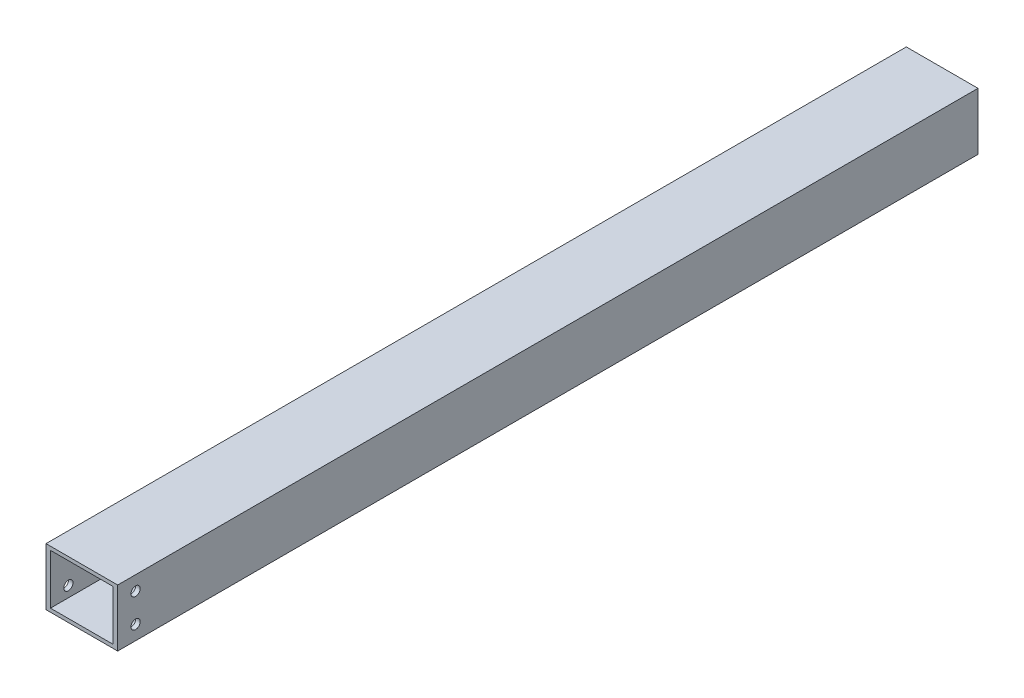
ISO-10303-21;
HEADER;
FILE_DESCRIPTION(('STEP AP214'),'2;1');
FILE_NAME('part.step','',(''),(''),'','','');
FILE_SCHEMA(('AUTOMOTIVE_DESIGN { 1 0 10303 214 1 1 1 1 }'));
ENDSEC;
DATA;
#1=APPLICATION_CONTEXT('core data for automotive mechanical design processes');
#2=APPLICATION_PROTOCOL_DEFINITION('international standard','automotive_design',2000,#1);
#3=PRODUCT_CONTEXT('',#1,'mechanical');
#4=PRODUCT('Part','Part','',(#3));
#5=PRODUCT_RELATED_PRODUCT_CATEGORY('part','',(#4));
#6=PRODUCT_DEFINITION_FORMATION('','',#4);
#7=PRODUCT_DEFINITION_CONTEXT('part definition',#1,'design');
#8=PRODUCT_DEFINITION('design','',#6,#7);
#9=PRODUCT_DEFINITION_SHAPE('','',#8);
#10=(LENGTH_UNIT() NAMED_UNIT(*) SI_UNIT(.MILLI.,.METRE.));
#11=(NAMED_UNIT(*) PLANE_ANGLE_UNIT() SI_UNIT($,.RADIAN.));
#12=(NAMED_UNIT(*) SI_UNIT($,.STERADIAN.) SOLID_ANGLE_UNIT());
#13=UNCERTAINTY_MEASURE_WITH_UNIT(LENGTH_MEASURE(1.E-05),#10,'distance_accuracy_value','');
#14=(GEOMETRIC_REPRESENTATION_CONTEXT(3) GLOBAL_UNCERTAINTY_ASSIGNED_CONTEXT((#13)) GLOBAL_UNIT_ASSIGNED_CONTEXT((#10,
#11,#12)) REPRESENTATION_CONTEXT('',''));
#15=CARTESIAN_POINT('',(0.,0.,0.));
#16=DIRECTION('',(0.,0.,1.));
#17=DIRECTION('',(1.,0.,0.));
#18=AXIS2_PLACEMENT_3D('',#15,#16,#17);
#19=CARTESIAN_POINT('',(0.,0.,304.8));
#20=DIRECTION('',(0.,0.,-1.));
#21=DIRECTION('',(-1.,0.,0.));
#22=AXIS2_PLACEMENT_3D('',#19,#20,#21);
#23=PLANE('',#22);
#24=DIRECTION('',(0.,1.,0.));
#25=VECTOR('',#24,1.);
#26=CARTESIAN_POINT('',(12.7,-10.137835371181,304.8));
#27=LINE('',#26,#25);
#28=CARTESIAN_POINT('',(12.7,-10.137835371181,304.8));
#29=VERTEX_POINT('',#28);
#30=CARTESIAN_POINT('',(12.7,10.137835371181,304.8));
#31=VERTEX_POINT('',#30);
#32=EDGE_CURVE('E138',#29,#31,#27,.T.);
#33=ORIENTED_EDGE('',*,*,#32,.T.);
#34=DIRECTION('',(-1.,0.,0.));
#35=VECTOR('',#34,1.);
#36=CARTESIAN_POINT('',(-12.7,10.137835371181,304.8));
#37=LINE('',#36,#35);
#38=CARTESIAN_POINT('',(-12.7,10.137835371181,304.8));
#39=VERTEX_POINT('',#38);
#40=EDGE_CURVE('E141',#31,#39,#37,.T.);
#41=ORIENTED_EDGE('',*,*,#40,.T.);
#42=DIRECTION('',(0.,-1.,0.));
#43=VECTOR('',#42,1.);
#44=CARTESIAN_POINT('',(-12.7,-10.137835371181,304.8));
#45=LINE('',#44,#43);
#46=CARTESIAN_POINT('',(-12.7,-10.137835371181,304.8));
#47=VERTEX_POINT('',#46);
#48=EDGE_CURVE('E144',#39,#47,#45,.T.);
#49=ORIENTED_EDGE('',*,*,#48,.T.);
#50=DIRECTION('',(1.,0.,0.));
#51=VECTOR('',#50,1.);
#52=CARTESIAN_POINT('',(-12.7,-10.137835371181,304.8));
#53=LINE('',#52,#51);
#54=EDGE_CURVE('E146',#47,#29,#53,.T.);
#55=ORIENTED_EDGE('',*,*,#54,.T.);
#56=EDGE_LOOP('',(#33,#41,#49,#55));
#57=FACE_BOUND('',#56,.T.);
#58=DIRECTION('',(0.,1.,0.));
#59=VECTOR('',#58,1.);
#60=CARTESIAN_POINT('',(11.1125,-8.87060594978338,304.8));
#61=LINE('',#60,#59);
#62=CARTESIAN_POINT('',(11.1125,-8.87060594978338,304.8));
#63=VERTEX_POINT('',#62);
#64=CARTESIAN_POINT('',(11.1125,8.87060594978337,304.8));
#65=VERTEX_POINT('',#64);
#66=EDGE_CURVE('E100',#63,#65,#61,.T.);
#67=ORIENTED_EDGE('',*,*,#66,.F.);
#68=DIRECTION('',(1.,0.,0.));
#69=VECTOR('',#68,1.);
#70=CARTESIAN_POINT('',(-11.1125,-8.87060594978338,304.8));
#71=LINE('',#70,#69);
#72=CARTESIAN_POINT('',(-11.1125,-8.87060594978338,304.8));
#73=VERTEX_POINT('',#72);
#74=EDGE_CURVE('E122',#73,#63,#71,.T.);
#75=ORIENTED_EDGE('',*,*,#74,.F.);
#76=DIRECTION('',(0.,-1.,0.));
#77=VECTOR('',#76,1.);
#78=CARTESIAN_POINT('',(-11.1125,-8.87060594978338,304.8));
#79=LINE('',#78,#77);
#80=CARTESIAN_POINT('',(-11.1125,8.87060594978337,304.8));
#81=VERTEX_POINT('',#80);
#82=EDGE_CURVE('E120',#81,#73,#79,.T.);
#83=ORIENTED_EDGE('',*,*,#82,.F.);
#84=DIRECTION('',(-1.,0.,0.));
#85=VECTOR('',#84,1.);
#86=CARTESIAN_POINT('',(-11.1125,8.87060594978337,304.8));
#87=LINE('',#86,#85);
#88=EDGE_CURVE('E108',#65,#81,#87,.T.);
#89=ORIENTED_EDGE('',*,*,#88,.F.);
#90=EDGE_LOOP('',(#67,#75,#83,#89));
#91=FACE_BOUND('',#90,.T.);
#92=ADVANCED_FACE('F33',(#57,#91),#23,.F.);
#93=CARTESIAN_POINT('',(0.,0.,0.));
#94=DIRECTION('',(0.,0.,-1.));
#95=DIRECTION('',(-1.,0.,0.));
#96=AXIS2_PLACEMENT_3D('',#93,#94,#95);
#97=PLANE('',#96);
#98=DIRECTION('',(0.,1.,0.));
#99=VECTOR('',#98,1.);
#100=CARTESIAN_POINT('',(12.7,-10.137835371181,0.));
#101=LINE('',#100,#99);
#102=CARTESIAN_POINT('',(12.7,-10.137835371181,0.));
#103=VERTEX_POINT('',#102);
#104=CARTESIAN_POINT('',(12.7,10.137835371181,0.));
#105=VERTEX_POINT('',#104);
#106=EDGE_CURVE('E116',#103,#105,#101,.T.);
#107=ORIENTED_EDGE('',*,*,#106,.F.);
#108=DIRECTION('',(1.,0.,0.));
#109=VECTOR('',#108,1.);
#110=CARTESIAN_POINT('',(-12.7,-10.137835371181,0.));
#111=LINE('',#110,#109);
#112=CARTESIAN_POINT('',(-12.7,-10.137835371181,0.));
#113=VERTEX_POINT('',#112);
#114=EDGE_CURVE('E142',#113,#103,#111,.T.);
#115=ORIENTED_EDGE('',*,*,#114,.F.);
#116=DIRECTION('',(0.,-1.,0.));
#117=VECTOR('',#116,1.);
#118=CARTESIAN_POINT('',(-12.7,-10.137835371181,0.));
#119=LINE('',#118,#117);
#120=CARTESIAN_POINT('',(-12.7,10.137835371181,0.));
#121=VERTEX_POINT('',#120);
#122=EDGE_CURVE('E153',#121,#113,#119,.T.);
#123=ORIENTED_EDGE('',*,*,#122,.F.);
#124=DIRECTION('',(-1.,0.,0.));
#125=VECTOR('',#124,1.);
#126=CARTESIAN_POINT('',(-12.7,10.137835371181,0.));
#127=LINE('',#126,#125);
#128=EDGE_CURVE('E151',#105,#121,#127,.T.);
#129=ORIENTED_EDGE('',*,*,#128,.F.);
#130=EDGE_LOOP('',(#107,#115,#123,#129));
#131=FACE_BOUND('',#130,.T.);
#132=DIRECTION('',(1.,0.,0.));
#133=VECTOR('',#132,1.);
#134=CARTESIAN_POINT('',(-11.1125,-8.87060594978338,0.));
#135=LINE('',#134,#133);
#136=CARTESIAN_POINT('',(-11.1125,-8.87060594978338,0.));
#137=VERTEX_POINT('',#136);
#138=CARTESIAN_POINT('',(11.1125,-8.87060594978338,0.));
#139=VERTEX_POINT('',#138);
#140=EDGE_CURVE('E109',#137,#139,#135,.T.);
#141=ORIENTED_EDGE('',*,*,#140,.T.);
#142=DIRECTION('',(0.,1.,0.));
#143=VECTOR('',#142,1.);
#144=CARTESIAN_POINT('',(11.1125,-8.87060594978338,0.));
#145=LINE('',#144,#143);
#146=CARTESIAN_POINT('',(11.1125,8.87060594978337,0.));
#147=VERTEX_POINT('',#146);
#148=EDGE_CURVE('E58',#139,#147,#145,.T.);
#149=ORIENTED_EDGE('',*,*,#148,.T.);
#150=DIRECTION('',(-1.,0.,0.));
#151=VECTOR('',#150,1.);
#152=CARTESIAN_POINT('',(-11.1125,8.87060594978337,0.));
#153=LINE('',#152,#151);
#154=CARTESIAN_POINT('',(-11.1125,8.87060594978337,0.));
#155=VERTEX_POINT('',#154);
#156=EDGE_CURVE('E115',#147,#155,#153,.T.);
#157=ORIENTED_EDGE('',*,*,#156,.T.);
#158=DIRECTION('',(0.,-1.,0.));
#159=VECTOR('',#158,1.);
#160=CARTESIAN_POINT('',(-11.1125,-8.87060594978338,0.));
#161=LINE('',#160,#159);
#162=EDGE_CURVE('E130',#155,#137,#161,.T.);
#163=ORIENTED_EDGE('',*,*,#162,.T.);
#164=EDGE_LOOP('',(#141,#149,#157,#163));
#165=FACE_BOUND('',#164,.T.);
#166=ADVANCED_FACE('F200',(#131,#165),#97,.T.);
#167=CARTESIAN_POINT('',(12.7,-10.137835371181,304.8));
#168=DIRECTION('',(-1.,0.,0.));
#169=DIRECTION('',(0.,0.,1.));
#170=AXIS2_PLACEMENT_3D('',#167,#168,#169);
#171=PLANE('',#170);
#172=CARTESIAN_POINT('',(12.7,-5.08,298.45));
#173=DIRECTION('',(1.,0.,0.));
#174=DIRECTION('',(0.,0.,1.));
#175=AXIS2_PLACEMENT_3D('',#172,#173,#174);
#176=CIRCLE('',#175,1.63195);
#177=CARTESIAN_POINT('',(12.7,-5.08,300.08195));
#178=VERTEX_POINT('',#177);
#179=EDGE_CURVE('E179',#178,#178,#176,.T.);
#180=ORIENTED_EDGE('',*,*,#179,.F.);
#181=EDGE_LOOP('',(#180));
#182=FACE_BOUND('',#181,.T.);
#183=CARTESIAN_POINT('',(12.7,5.08,298.45));
#184=DIRECTION('',(1.,0.,0.));
#185=DIRECTION('',(0.,0.,-1.));
#186=AXIS2_PLACEMENT_3D('',#183,#184,#185);
#187=CIRCLE('',#186,1.63195);
#188=CARTESIAN_POINT('',(12.7,5.08,296.81805));
#189=VERTEX_POINT('',#188);
#190=EDGE_CURVE('E169',#189,#189,#187,.T.);
#191=ORIENTED_EDGE('',*,*,#190,.F.);
#192=EDGE_LOOP('',(#191));
#193=FACE_BOUND('',#192,.T.);
#194=ORIENTED_EDGE('',*,*,#106,.T.);
#195=DIRECTION('',(0.,0.,-1.));
#196=VECTOR('',#195,1.);
#197=CARTESIAN_POINT('',(12.7,10.137835371181,304.8));
#198=LINE('',#197,#196);
#199=EDGE_CURVE('E11',#31,#105,#198,.T.);
#200=ORIENTED_EDGE('',*,*,#199,.F.);
#201=ORIENTED_EDGE('',*,*,#32,.F.);
#202=DIRECTION('',(0.,0.,-1.));
#203=VECTOR('',#202,1.);
#204=CARTESIAN_POINT('',(12.7,-10.137835371181,304.8));
#205=LINE('',#204,#203);
#206=EDGE_CURVE('E148',#29,#103,#205,.T.);
#207=ORIENTED_EDGE('',*,*,#206,.T.);
#208=EDGE_LOOP('',(#194,#200,#201,#207));
#209=FACE_BOUND('',#208,.T.);
#210=ADVANCED_FACE('F35',(#182,#193,#209),#171,.F.);
#211=CARTESIAN_POINT('',(-12.7,10.137835371181,304.8));
#212=DIRECTION('',(0.,-1.,0.));
#213=DIRECTION('',(0.,0.,-1.));
#214=AXIS2_PLACEMENT_3D('',#211,#212,#213);
#215=PLANE('',#214);
#216=ORIENTED_EDGE('',*,*,#128,.T.);
#217=DIRECTION('',(0.,0.,-1.));
#218=VECTOR('',#217,1.);
#219=CARTESIAN_POINT('',(-12.7,10.137835371181,304.8));
#220=LINE('',#219,#218);
#221=EDGE_CURVE('E42',#39,#121,#220,.T.);
#222=ORIENTED_EDGE('',*,*,#221,.F.);
#223=ORIENTED_EDGE('',*,*,#40,.F.);
#224=ORIENTED_EDGE('',*,*,#199,.T.);
#225=EDGE_LOOP('',(#216,#222,#223,#224));
#226=FACE_BOUND('',#225,.T.);
#227=ADVANCED_FACE('F226',(#226),#215,.F.);
#228=CARTESIAN_POINT('',(-12.7,-10.137835371181,304.8));
#229=DIRECTION('',(1.,0.,0.));
#230=DIRECTION('',(0.,0.,-1.));
#231=AXIS2_PLACEMENT_3D('',#228,#229,#230);
#232=PLANE('',#231);
#233=CARTESIAN_POINT('',(-12.7,-5.08,298.45));
#234=DIRECTION('',(1.,0.,0.));
#235=DIRECTION('',(0.,0.,1.));
#236=AXIS2_PLACEMENT_3D('',#233,#234,#235);
#237=CIRCLE('',#236,1.63195);
#238=CARTESIAN_POINT('',(-12.7,-5.08,300.08195));
#239=VERTEX_POINT('',#238);
#240=EDGE_CURVE('E182',#239,#239,#237,.T.);
#241=ORIENTED_EDGE('',*,*,#240,.T.);
#242=EDGE_LOOP('',(#241));
#243=FACE_BOUND('',#242,.T.);
#244=CARTESIAN_POINT('',(-12.7,5.08,298.45));
#245=DIRECTION('',(1.,0.,0.));
#246=DIRECTION('',(0.,0.,-1.));
#247=AXIS2_PLACEMENT_3D('',#244,#245,#246);
#248=CIRCLE('',#247,1.63195);
#249=CARTESIAN_POINT('',(-12.7,5.08,296.81805));
#250=VERTEX_POINT('',#249);
#251=EDGE_CURVE('E164',#250,#250,#248,.T.);
#252=ORIENTED_EDGE('',*,*,#251,.T.);
#253=EDGE_LOOP('',(#252));
#254=FACE_BOUND('',#253,.T.);
#255=ORIENTED_EDGE('',*,*,#122,.T.);
#256=DIRECTION('',(0.,0.,-1.));
#257=VECTOR('',#256,1.);
#258=CARTESIAN_POINT('',(-12.7,-10.137835371181,304.8));
#259=LINE('',#258,#257);
#260=EDGE_CURVE('E158',#47,#113,#259,.T.);
#261=ORIENTED_EDGE('',*,*,#260,.F.);
#262=ORIENTED_EDGE('',*,*,#48,.F.);
#263=ORIENTED_EDGE('',*,*,#221,.T.);
#264=EDGE_LOOP('',(#255,#261,#262,#263));
#265=FACE_BOUND('',#264,.T.);
#266=ADVANCED_FACE('F223',(#243,#254,#265),#232,.F.);
#267=CARTESIAN_POINT('',(-12.7,-10.137835371181,304.8));
#268=DIRECTION('',(0.,1.,0.));
#269=DIRECTION('',(-1.,0.,0.));
#270=AXIS2_PLACEMENT_3D('',#267,#268,#269);
#271=PLANE('',#270);
#272=ORIENTED_EDGE('',*,*,#114,.T.);
#273=ORIENTED_EDGE('',*,*,#206,.F.);
#274=ORIENTED_EDGE('',*,*,#54,.F.);
#275=ORIENTED_EDGE('',*,*,#260,.T.);
#276=EDGE_LOOP('',(#272,#273,#274,#275));
#277=FACE_BOUND('',#276,.T.);
#278=ADVANCED_FACE('F220',(#277),#271,.F.);
#279=CARTESIAN_POINT('',(11.1125,-8.87060594978338,304.8));
#280=DIRECTION('',(-1.,0.,0.));
#281=DIRECTION('',(0.,0.,1.));
#282=AXIS2_PLACEMENT_3D('',#279,#280,#281);
#283=PLANE('',#282);
#284=CARTESIAN_POINT('',(11.1125,-5.08,298.45));
#285=DIRECTION('',(-1.,0.,0.));
#286=DIRECTION('',(0.,0.,1.));
#287=AXIS2_PLACEMENT_3D('',#284,#285,#286);
#288=CIRCLE('',#287,1.63195);
#289=CARTESIAN_POINT('',(11.1125,-5.08,300.08195));
#290=VERTEX_POINT('',#289);
#291=EDGE_CURVE('E174',#290,#290,#288,.T.);
#292=ORIENTED_EDGE('',*,*,#291,.F.);
#293=EDGE_LOOP('',(#292));
#294=FACE_BOUND('',#293,.T.);
#295=CARTESIAN_POINT('',(11.1125,5.08,298.45));
#296=DIRECTION('',(-1.,0.,0.));
#297=DIRECTION('',(0.,0.,1.));
#298=AXIS2_PLACEMENT_3D('',#295,#296,#297);
#299=CIRCLE('',#298,1.63195);
#300=CARTESIAN_POINT('',(11.1125,5.08,300.08195));
#301=VERTEX_POINT('',#300);
#302=EDGE_CURVE('E128',#301,#301,#299,.T.);
#303=ORIENTED_EDGE('',*,*,#302,.F.);
#304=EDGE_LOOP('',(#303));
#305=FACE_BOUND('',#304,.T.);
#306=ORIENTED_EDGE('',*,*,#148,.F.);
#307=DIRECTION('',(0.,0.,-1.));
#308=VECTOR('',#307,1.);
#309=CARTESIAN_POINT('',(11.1125,-8.87060594978338,304.8));
#310=LINE('',#309,#308);
#311=EDGE_CURVE('E104',#63,#139,#310,.T.);
#312=ORIENTED_EDGE('',*,*,#311,.F.);
#313=ORIENTED_EDGE('',*,*,#66,.T.);
#314=DIRECTION('',(0.,0.,-1.));
#315=VECTOR('',#314,1.);
#316=CARTESIAN_POINT('',(11.1125,8.87060594978337,304.8));
#317=LINE('',#316,#315);
#318=EDGE_CURVE('E103',#65,#147,#317,.T.);
#319=ORIENTED_EDGE('',*,*,#318,.T.);
#320=EDGE_LOOP('',(#306,#312,#313,#319));
#321=FACE_BOUND('',#320,.T.);
#322=ADVANCED_FACE('F102',(#294,#305,#321),#283,.T.);
#323=CARTESIAN_POINT('',(-11.1125,8.87060594978337,304.8));
#324=DIRECTION('',(0.,-1.,0.));
#325=DIRECTION('',(1.,0.,0.));
#326=AXIS2_PLACEMENT_3D('',#323,#324,#325);
#327=PLANE('',#326);
#328=ORIENTED_EDGE('',*,*,#156,.F.);
#329=ORIENTED_EDGE('',*,*,#318,.F.);
#330=ORIENTED_EDGE('',*,*,#88,.T.);
#331=DIRECTION('',(0.,0.,-1.));
#332=VECTOR('',#331,1.);
#333=CARTESIAN_POINT('',(-11.1125,8.87060594978337,304.8));
#334=LINE('',#333,#332);
#335=EDGE_CURVE('E117',#81,#155,#334,.T.);
#336=ORIENTED_EDGE('',*,*,#335,.T.);
#337=EDGE_LOOP('',(#328,#329,#330,#336));
#338=FACE_BOUND('',#337,.T.);
#339=ADVANCED_FACE('F112',(#338),#327,.T.);
#340=CARTESIAN_POINT('',(-11.1125,-8.87060594978338,304.8));
#341=DIRECTION('',(1.,0.,0.));
#342=DIRECTION('',(0.,0.,-1.));
#343=AXIS2_PLACEMENT_3D('',#340,#341,#342);
#344=PLANE('',#343);
#345=CARTESIAN_POINT('',(-11.1125,-5.08,298.45));
#346=DIRECTION('',(1.,0.,0.));
#347=DIRECTION('',(0.,0.,-1.));
#348=AXIS2_PLACEMENT_3D('',#345,#346,#347);
#349=CIRCLE('',#348,1.63195);
#350=CARTESIAN_POINT('',(-11.1125,-5.08,296.81805));
#351=VERTEX_POINT('',#350);
#352=EDGE_CURVE('E37',#351,#351,#349,.T.);
#353=ORIENTED_EDGE('',*,*,#352,.F.);
#354=EDGE_LOOP('',(#353));
#355=FACE_BOUND('',#354,.T.);
#356=CARTESIAN_POINT('',(-11.1125,5.08,298.45));
#357=DIRECTION('',(1.,0.,0.));
#358=DIRECTION('',(0.,0.,-1.));
#359=AXIS2_PLACEMENT_3D('',#356,#357,#358);
#360=CIRCLE('',#359,1.63195);
#361=CARTESIAN_POINT('',(-11.1125,5.08,296.81805));
#362=VERTEX_POINT('',#361);
#363=EDGE_CURVE('E162',#362,#362,#360,.T.);
#364=ORIENTED_EDGE('',*,*,#363,.F.);
#365=EDGE_LOOP('',(#364));
#366=FACE_BOUND('',#365,.T.);
#367=ORIENTED_EDGE('',*,*,#162,.F.);
#368=ORIENTED_EDGE('',*,*,#335,.F.);
#369=ORIENTED_EDGE('',*,*,#82,.T.);
#370=DIRECTION('',(0.,0.,-1.));
#371=VECTOR('',#370,1.);
#372=CARTESIAN_POINT('',(-11.1125,-8.87060594978338,304.8));
#373=LINE('',#372,#371);
#374=EDGE_CURVE('E50',#73,#137,#373,.T.);
#375=ORIENTED_EDGE('',*,*,#374,.T.);
#376=EDGE_LOOP('',(#367,#368,#369,#375));
#377=FACE_BOUND('',#376,.T.);
#378=ADVANCED_FACE('F192',(#355,#366,#377),#344,.T.);
#379=CARTESIAN_POINT('',(-11.1125,-8.87060594978338,304.8));
#380=DIRECTION('',(0.,1.,0.));
#381=DIRECTION('',(0.,0.,1.));
#382=AXIS2_PLACEMENT_3D('',#379,#380,#381);
#383=PLANE('',#382);
#384=ORIENTED_EDGE('',*,*,#140,.F.);
#385=ORIENTED_EDGE('',*,*,#374,.F.);
#386=ORIENTED_EDGE('',*,*,#74,.T.);
#387=ORIENTED_EDGE('',*,*,#311,.T.);
#388=EDGE_LOOP('',(#384,#385,#386,#387));
#389=FACE_BOUND('',#388,.T.);
#390=ADVANCED_FACE('F195',(#389),#383,.T.);
#391=CARTESIAN_POINT('',(-12.7,5.08,298.45));
#392=DIRECTION('',(1.,0.,0.));
#393=DIRECTION('',(0.,0.,-1.));
#394=AXIS2_PLACEMENT_3D('',#391,#392,#393);
#395=CYLINDRICAL_SURFACE('',#394,1.63195);
#396=ORIENTED_EDGE('',*,*,#363,.T.);
#397=EDGE_LOOP('',(#396));
#398=FACE_BOUND('',#397,.T.);
#399=ORIENTED_EDGE('',*,*,#251,.F.);
#400=EDGE_LOOP('',(#399));
#401=FACE_BOUND('',#400,.T.);
#402=ADVANCED_FACE('F202',(#398,#401),#395,.F.);
#403=ORIENTED_EDGE('',*,*,#302,.T.);
#404=EDGE_LOOP('',(#403));
#405=FACE_BOUND('',#404,.T.);
#406=ORIENTED_EDGE('',*,*,#190,.T.);
#407=EDGE_LOOP('',(#406));
#408=FACE_BOUND('',#407,.T.);
#409=ADVANCED_FACE('F207',(#405,#408),#395,.F.);
#410=CARTESIAN_POINT('',(-12.7,-5.08,298.45));
#411=DIRECTION('',(1.,0.,0.));
#412=DIRECTION('',(0.,0.,-1.));
#413=AXIS2_PLACEMENT_3D('',#410,#411,#412);
#414=CYLINDRICAL_SURFACE('',#413,1.63195);
#415=ORIENTED_EDGE('',*,*,#352,.T.);
#416=EDGE_LOOP('',(#415));
#417=FACE_BOUND('',#416,.T.);
#418=ORIENTED_EDGE('',*,*,#240,.F.);
#419=EDGE_LOOP('',(#418));
#420=FACE_BOUND('',#419,.T.);
#421=ADVANCED_FACE('F189',(#417,#420),#414,.F.);
#422=ORIENTED_EDGE('',*,*,#291,.T.);
#423=EDGE_LOOP('',(#422));
#424=FACE_BOUND('',#423,.T.);
#425=ORIENTED_EDGE('',*,*,#179,.T.);
#426=EDGE_LOOP('',(#425));
#427=FACE_BOUND('',#426,.T.);
#428=ADVANCED_FACE('F256',(#424,#427),#414,.F.);
#429=CLOSED_SHELL('',(#92,#166,#210,#227,#266,#278,#322,#339,#378,#390,#402,#409,#421,#428));
#430=MANIFOLD_SOLID_BREP('B2',#429);
#431=ADVANCED_BREP_SHAPE_REPRESENTATION('',(#18,#430),#14);
#432=SHAPE_DEFINITION_REPRESENTATION(#9,#431);
ENDSEC;
END-ISO-10303-21;
